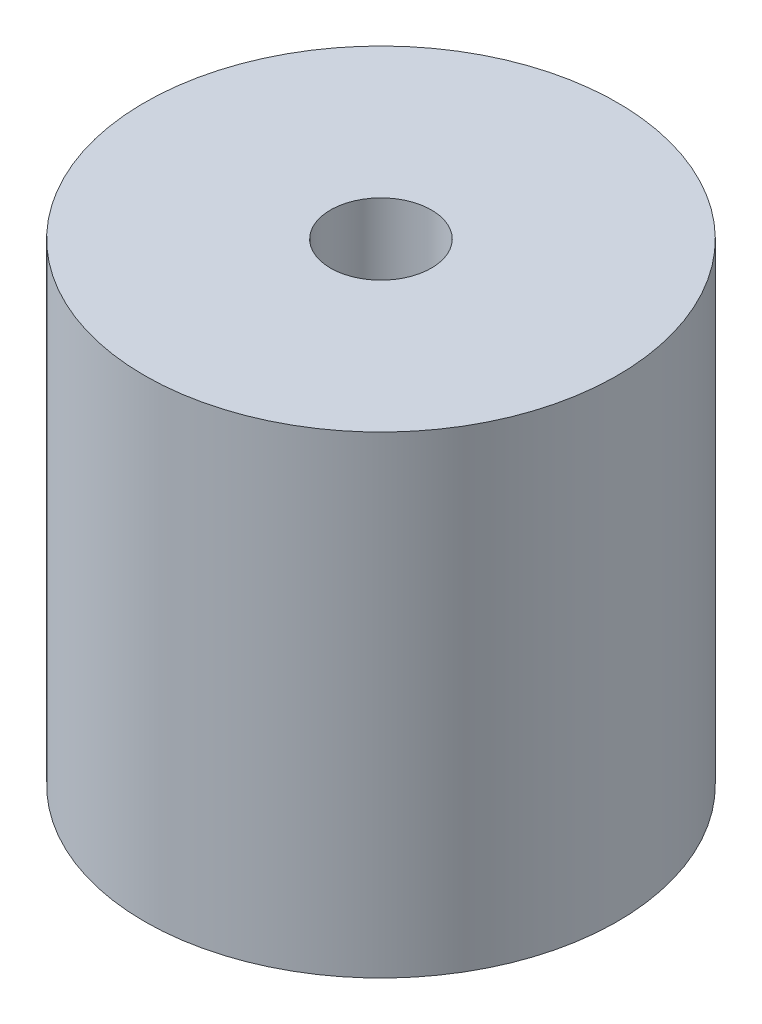
ISO-10303-21;
HEADER;
FILE_DESCRIPTION(('STEP AP214'),'2;1');
FILE_NAME('part.step','',(''),(''),'','','');
FILE_SCHEMA(('AUTOMOTIVE_DESIGN { 1 0 10303 214 1 1 1 1 }'));
ENDSEC;
DATA;
#1=APPLICATION_CONTEXT('core data for automotive mechanical design processes');
#2=APPLICATION_PROTOCOL_DEFINITION('international standard','automotive_design',2000,#1);
#3=PRODUCT_CONTEXT('',#1,'mechanical');
#4=PRODUCT('Part','Part','',(#3));
#5=PRODUCT_RELATED_PRODUCT_CATEGORY('part','',(#4));
#6=PRODUCT_DEFINITION_FORMATION('','',#4);
#7=PRODUCT_DEFINITION_CONTEXT('part definition',#1,'design');
#8=PRODUCT_DEFINITION('design','',#6,#7);
#9=PRODUCT_DEFINITION_SHAPE('','',#8);
#10=(LENGTH_UNIT() NAMED_UNIT(*) SI_UNIT(.MILLI.,.METRE.));
#11=(NAMED_UNIT(*) PLANE_ANGLE_UNIT() SI_UNIT($,.RADIAN.));
#12=(NAMED_UNIT(*) SI_UNIT($,.STERADIAN.) SOLID_ANGLE_UNIT());
#13=UNCERTAINTY_MEASURE_WITH_UNIT(LENGTH_MEASURE(1.E-05),#10,'distance_accuracy_value','');
#14=(GEOMETRIC_REPRESENTATION_CONTEXT(3) GLOBAL_UNCERTAINTY_ASSIGNED_CONTEXT((#13)) GLOBAL_UNIT_ASSIGNED_CONTEXT((#10,
#11,#12)) REPRESENTATION_CONTEXT('',''));
#15=CARTESIAN_POINT('',(0.,0.,0.));
#16=DIRECTION('',(0.,0.,1.));
#17=DIRECTION('',(1.,0.,0.));
#18=AXIS2_PLACEMENT_3D('',#15,#16,#17);
#19=CARTESIAN_POINT('',(0.,15.,0.));
#20=DIRECTION('',(0.,1.,0.));
#21=DIRECTION('',(0.,0.,1.));
#22=AXIS2_PLACEMENT_3D('',#19,#20,#21);
#23=PLANE('',#22);
#24=CARTESIAN_POINT('',(0.,15.,0.));
#25=DIRECTION('',(0.,1.,0.));
#26=DIRECTION('',(0.,0.,1.));
#27=AXIS2_PLACEMENT_3D('',#24,#25,#26);
#28=CIRCLE('',#27,7.5);
#29=CARTESIAN_POINT('',(0.,15.,7.5));
#30=VERTEX_POINT('',#29);
#31=EDGE_CURVE('E10',#30,#30,#28,.T.);
#32=ORIENTED_EDGE('',*,*,#31,.T.);
#33=EDGE_LOOP('',(#32));
#34=FACE_BOUND('',#33,.T.);
#35=CARTESIAN_POINT('',(0.,15.,0.));
#36=DIRECTION('',(0.,1.,0.));
#37=DIRECTION('',(0.,0.,1.));
#38=AXIS2_PLACEMENT_3D('',#35,#36,#37);
#39=CIRCLE('',#38,1.6);
#40=CARTESIAN_POINT('',(0.,15.,1.6));
#41=VERTEX_POINT('',#40);
#42=EDGE_CURVE('E56',#41,#41,#39,.T.);
#43=ORIENTED_EDGE('',*,*,#42,.F.);
#44=EDGE_LOOP('',(#43));
#45=FACE_BOUND('',#44,.T.);
#46=ADVANCED_FACE('F43',(#34,#45),#23,.T.);
#47=CARTESIAN_POINT('',(0.,0.,0.));
#48=DIRECTION('',(0.,1.,0.));
#49=DIRECTION('',(0.,0.,1.));
#50=AXIS2_PLACEMENT_3D('',#47,#48,#49);
#51=PLANE('',#50);
#52=CARTESIAN_POINT('',(0.,0.,0.));
#53=DIRECTION('',(0.,1.,0.));
#54=DIRECTION('',(0.,0.,1.));
#55=AXIS2_PLACEMENT_3D('',#52,#53,#54);
#56=CIRCLE('',#55,7.5);
#57=CARTESIAN_POINT('',(0.,0.,7.5));
#58=VERTEX_POINT('',#57);
#59=EDGE_CURVE('E47',#58,#58,#56,.T.);
#60=ORIENTED_EDGE('',*,*,#59,.F.);
#61=EDGE_LOOP('',(#60));
#62=FACE_BOUND('',#61,.T.);
#63=CARTESIAN_POINT('',(0.,0.,0.));
#64=DIRECTION('',(0.,1.,0.));
#65=DIRECTION('',(0.,0.,1.));
#66=AXIS2_PLACEMENT_3D('',#63,#64,#65);
#67=CIRCLE('',#66,1.6);
#68=CARTESIAN_POINT('',(0.,0.,1.6));
#69=VERTEX_POINT('',#68);
#70=EDGE_CURVE('E58',#69,#69,#67,.T.);
#71=ORIENTED_EDGE('',*,*,#70,.T.);
#72=EDGE_LOOP('',(#71));
#73=FACE_BOUND('',#72,.T.);
#74=ADVANCED_FACE('F70',(#62,#73),#51,.F.);
#75=CARTESIAN_POINT('',(0.,15.,0.));
#76=DIRECTION('',(0.,-1.,0.));
#77=DIRECTION('',(0.,0.,-1.));
#78=AXIS2_PLACEMENT_3D('',#75,#76,#77);
#79=CYLINDRICAL_SURFACE('',#78,7.5);
#80=ORIENTED_EDGE('',*,*,#31,.F.);
#81=EDGE_LOOP('',(#80));
#82=FACE_BOUND('',#81,.T.);
#83=ORIENTED_EDGE('',*,*,#59,.T.);
#84=EDGE_LOOP('',(#83));
#85=FACE_BOUND('',#84,.T.);
#86=ADVANCED_FACE('F45',(#82,#85),#79,.T.);
#87=CARTESIAN_POINT('',(0.,15.,0.));
#88=DIRECTION('',(0.,-1.,0.));
#89=DIRECTION('',(0.,0.,-1.));
#90=AXIS2_PLACEMENT_3D('',#87,#88,#89);
#91=CYLINDRICAL_SURFACE('',#90,1.6);
#92=ORIENTED_EDGE('',*,*,#42,.T.);
#93=EDGE_LOOP('',(#92));
#94=FACE_BOUND('',#93,.T.);
#95=ORIENTED_EDGE('',*,*,#70,.F.);
#96=EDGE_LOOP('',(#95));
#97=FACE_BOUND('',#96,.T.);
#98=ADVANCED_FACE('F66',(#94,#97),#91,.F.);
#99=CLOSED_SHELL('',(#46,#74,#86,#98));
#100=MANIFOLD_SOLID_BREP('B2',#99);
#101=ADVANCED_BREP_SHAPE_REPRESENTATION('',(#18,#100),#14);
#102=SHAPE_DEFINITION_REPRESENTATION(#9,#101);
ENDSEC;
END-ISO-10303-21;
